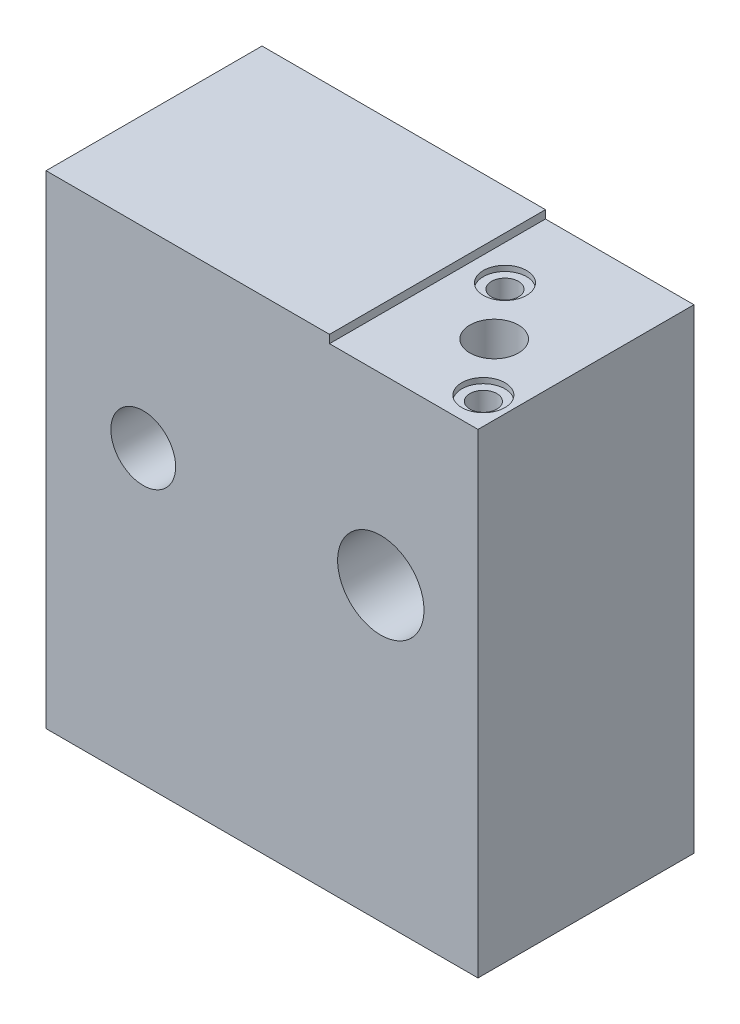
ISO-10303-21;
HEADER;
FILE_DESCRIPTION(('STEP AP214'),'2;1');
FILE_NAME('part.step','',(''),(''),'','','');
FILE_SCHEMA(('AUTOMOTIVE_DESIGN { 1 0 10303 214 1 1 1 1 }'));
ENDSEC;
DATA;
#1=APPLICATION_CONTEXT('core data for automotive mechanical design processes');
#2=APPLICATION_PROTOCOL_DEFINITION('international standard','automotive_design',2000,#1);
#3=PRODUCT_CONTEXT('',#1,'mechanical');
#4=PRODUCT('Part','Part','',(#3));
#5=PRODUCT_RELATED_PRODUCT_CATEGORY('part','',(#4));
#6=PRODUCT_DEFINITION_FORMATION('','',#4);
#7=PRODUCT_DEFINITION_CONTEXT('part definition',#1,'design');
#8=PRODUCT_DEFINITION('design','',#6,#7);
#9=PRODUCT_DEFINITION_SHAPE('','',#8);
#10=(LENGTH_UNIT() NAMED_UNIT(*) SI_UNIT(.MILLI.,.METRE.));
#11=(NAMED_UNIT(*) PLANE_ANGLE_UNIT() SI_UNIT($,.RADIAN.));
#12=(NAMED_UNIT(*) SI_UNIT($,.STERADIAN.) SOLID_ANGLE_UNIT());
#13=UNCERTAINTY_MEASURE_WITH_UNIT(LENGTH_MEASURE(1.E-05),#10,'distance_accuracy_value','');
#14=(GEOMETRIC_REPRESENTATION_CONTEXT(3) GLOBAL_UNCERTAINTY_ASSIGNED_CONTEXT((#13)) GLOBAL_UNIT_ASSIGNED_CONTEXT((#10,
#11,#12)) REPRESENTATION_CONTEXT('',''));
#15=CARTESIAN_POINT('',(0.,0.,0.));
#16=DIRECTION('',(0.,0.,1.));
#17=DIRECTION('',(1.,0.,0.));
#18=AXIS2_PLACEMENT_3D('',#15,#16,#17);
#19=CARTESIAN_POINT('',(40.,89.5,20.));
#20=DIRECTION('',(-1.,0.,0.));
#21=DIRECTION('',(0.,0.,1.));
#22=AXIS2_PLACEMENT_3D('',#19,#20,#21);
#23=PLANE('',#22);
#24=DIRECTION('',(0.,-1.,0.));
#25=VECTOR('',#24,1.);
#26=CARTESIAN_POINT('',(40.,89.5,-20.));
#27=LINE('',#26,#25);
#28=CARTESIAN_POINT('',(40.,88.,-20.));
#29=VERTEX_POINT('',#28);
#30=CARTESIAN_POINT('',(40.,0.,-20.));
#31=VERTEX_POINT('',#30);
#32=EDGE_CURVE('E45',#29,#31,#27,.T.);
#33=ORIENTED_EDGE('',*,*,#32,.F.);
#34=DIRECTION('',(0.,0.,1.));
#35=VECTOR('',#34,1.);
#36=CARTESIAN_POINT('',(40.,88.,-26.));
#37=LINE('',#36,#35);
#38=CARTESIAN_POINT('',(40.,88.,20.));
#39=VERTEX_POINT('',#38);
#40=EDGE_CURVE('E88',#29,#39,#37,.T.);
#41=ORIENTED_EDGE('',*,*,#40,.T.);
#42=DIRECTION('',(0.,-1.,0.));
#43=VECTOR('',#42,1.);
#44=CARTESIAN_POINT('',(40.,89.5,20.));
#45=LINE('',#44,#43);
#46=CARTESIAN_POINT('',(40.,0.,20.));
#47=VERTEX_POINT('',#46);
#48=EDGE_CURVE('E81',#39,#47,#45,.T.);
#49=ORIENTED_EDGE('',*,*,#48,.T.);
#50=DIRECTION('',(0.,0.,-1.));
#51=VECTOR('',#50,1.);
#52=CARTESIAN_POINT('',(40.,0.,20.));
#53=LINE('',#52,#51);
#54=EDGE_CURVE('E85',#47,#31,#53,.T.);
#55=ORIENTED_EDGE('',*,*,#54,.T.);
#56=EDGE_LOOP('',(#33,#41,#49,#55));
#57=FACE_BOUND('',#56,.T.);
#58=ADVANCED_FACE('F37',(#57),#23,.F.);
#59=CARTESIAN_POINT('',(-40.,89.5,-20.));
#60=DIRECTION('',(0.,0.,1.));
#61=DIRECTION('',(1.,0.,0.));
#62=AXIS2_PLACEMENT_3D('',#59,#60,#61);
#63=PLANE('',#62);
#64=CARTESIAN_POINT('',(22.,54.,-20.));
#65=DIRECTION('',(0.,0.,1.));
#66=DIRECTION('',(1.,0.,0.));
#67=AXIS2_PLACEMENT_3D('',#64,#65,#66);
#68=CIRCLE('',#67,8.);
#69=CARTESIAN_POINT('',(30.,54.,-20.));
#70=VERTEX_POINT('',#69);
#71=EDGE_CURVE('E151',#70,#70,#68,.T.);
#72=ORIENTED_EDGE('',*,*,#71,.T.);
#73=EDGE_LOOP('',(#72));
#74=FACE_BOUND('',#73,.T.);
#75=CARTESIAN_POINT('',(-22.,54.,-20.));
#76=DIRECTION('',(0.,0.,1.));
#77=DIRECTION('',(1.,0.,0.));
#78=AXIS2_PLACEMENT_3D('',#75,#76,#77);
#79=CIRCLE('',#78,6.);
#80=CARTESIAN_POINT('',(-16.,54.,-20.));
#81=VERTEX_POINT('',#80);
#82=EDGE_CURVE('E157',#81,#81,#79,.T.);
#83=ORIENTED_EDGE('',*,*,#82,.T.);
#84=EDGE_LOOP('',(#83));
#85=FACE_BOUND('',#84,.T.);
#86=DIRECTION('',(0.,-1.,0.));
#87=VECTOR('',#86,1.);
#88=CARTESIAN_POINT('',(12.5,89.5,-20.));
#89=LINE('',#88,#87);
#90=CARTESIAN_POINT('',(12.5,89.5,-20.));
#91=VERTEX_POINT('',#90);
#92=CARTESIAN_POINT('',(12.5,88.,-20.));
#93=VERTEX_POINT('',#92);
#94=EDGE_CURVE('E53',#91,#93,#89,.T.);
#95=ORIENTED_EDGE('',*,*,#94,.T.);
#96=DIRECTION('',(1.,0.,0.));
#97=VECTOR('',#96,1.);
#98=CARTESIAN_POINT('',(-40.,88.,-20.));
#99=LINE('',#98,#97);
#100=EDGE_CURVE('E107',#93,#29,#99,.T.);
#101=ORIENTED_EDGE('',*,*,#100,.T.);
#102=ORIENTED_EDGE('',*,*,#32,.T.);
#103=DIRECTION('',(-1.,0.,0.));
#104=VECTOR('',#103,1.);
#105=CARTESIAN_POINT('',(-40.,0.,-20.));
#106=LINE('',#105,#104);
#107=CARTESIAN_POINT('',(-40.,0.,-20.));
#108=VERTEX_POINT('',#107);
#109=EDGE_CURVE('E106',#31,#108,#106,.T.);
#110=ORIENTED_EDGE('',*,*,#109,.T.);
#111=DIRECTION('',(0.,-1.,0.));
#112=VECTOR('',#111,1.);
#113=CARTESIAN_POINT('',(-40.,89.5,-20.));
#114=LINE('',#113,#112);
#115=CARTESIAN_POINT('',(-40.,89.5,-20.));
#116=VERTEX_POINT('',#115);
#117=EDGE_CURVE('E117',#116,#108,#114,.T.);
#118=ORIENTED_EDGE('',*,*,#117,.F.);
#119=DIRECTION('',(-1.,0.,0.));
#120=VECTOR('',#119,1.);
#121=CARTESIAN_POINT('',(-40.,89.5,-20.));
#122=LINE('',#121,#120);
#123=EDGE_CURVE('E101',#91,#116,#122,.T.);
#124=ORIENTED_EDGE('',*,*,#123,.F.);
#125=EDGE_LOOP('',(#95,#101,#102,#110,#118,#124));
#126=FACE_BOUND('',#125,.T.);
#127=ADVANCED_FACE('F186',(#74,#85,#126),#63,.F.);
#128=CARTESIAN_POINT('',(-40.,89.5,20.));
#129=DIRECTION('',(1.,0.,0.));
#130=DIRECTION('',(0.,0.,-1.));
#131=AXIS2_PLACEMENT_3D('',#128,#129,#130);
#132=PLANE('',#131);
#133=DIRECTION('',(0.,0.,1.));
#134=VECTOR('',#133,1.);
#135=CARTESIAN_POINT('',(-40.,0.,20.));
#136=LINE('',#135,#134);
#137=CARTESIAN_POINT('',(-40.,0.,20.));
#138=VERTEX_POINT('',#137);
#139=EDGE_CURVE('E102',#108,#138,#136,.T.);
#140=ORIENTED_EDGE('',*,*,#139,.T.);
#141=DIRECTION('',(0.,-1.,0.));
#142=VECTOR('',#141,1.);
#143=CARTESIAN_POINT('',(-40.,89.5,20.));
#144=LINE('',#143,#142);
#145=CARTESIAN_POINT('',(-40.,89.5,20.));
#146=VERTEX_POINT('',#145);
#147=EDGE_CURVE('E91',#146,#138,#144,.T.);
#148=ORIENTED_EDGE('',*,*,#147,.F.);
#149=DIRECTION('',(0.,0.,1.));
#150=VECTOR('',#149,1.);
#151=CARTESIAN_POINT('',(-40.,89.5,20.));
#152=LINE('',#151,#150);
#153=EDGE_CURVE('E61',#116,#146,#152,.T.);
#154=ORIENTED_EDGE('',*,*,#153,.F.);
#155=ORIENTED_EDGE('',*,*,#117,.T.);
#156=EDGE_LOOP('',(#140,#148,#154,#155));
#157=FACE_BOUND('',#156,.T.);
#158=ADVANCED_FACE('F189',(#157),#132,.F.);
#159=CARTESIAN_POINT('',(-40.,89.5,20.));
#160=DIRECTION('',(0.,0.,-1.));
#161=DIRECTION('',(-1.,0.,0.));
#162=AXIS2_PLACEMENT_3D('',#159,#160,#161);
#163=PLANE('',#162);
#164=CARTESIAN_POINT('',(22.,54.,20.));
#165=DIRECTION('',(0.,0.,1.));
#166=DIRECTION('',(1.,0.,0.));
#167=AXIS2_PLACEMENT_3D('',#164,#165,#166);
#168=CIRCLE('',#167,8.);
#169=CARTESIAN_POINT('',(30.,54.,20.));
#170=VERTEX_POINT('',#169);
#171=EDGE_CURVE('E148',#170,#170,#168,.T.);
#172=ORIENTED_EDGE('',*,*,#171,.F.);
#173=EDGE_LOOP('',(#172));
#174=FACE_BOUND('',#173,.T.);
#175=CARTESIAN_POINT('',(-22.,54.,20.));
#176=DIRECTION('',(0.,0.,1.));
#177=DIRECTION('',(1.,0.,0.));
#178=AXIS2_PLACEMENT_3D('',#175,#176,#177);
#179=CIRCLE('',#178,6.);
#180=CARTESIAN_POINT('',(-16.,54.,20.));
#181=VERTEX_POINT('',#180);
#182=EDGE_CURVE('E154',#181,#181,#179,.T.);
#183=ORIENTED_EDGE('',*,*,#182,.F.);
#184=EDGE_LOOP('',(#183));
#185=FACE_BOUND('',#184,.T.);
#186=ORIENTED_EDGE('',*,*,#48,.F.);
#187=DIRECTION('',(1.,0.,0.));
#188=VECTOR('',#187,1.);
#189=CARTESIAN_POINT('',(40.,88.,20.));
#190=LINE('',#189,#188);
#191=CARTESIAN_POINT('',(12.5,88.,20.));
#192=VERTEX_POINT('',#191);
#193=EDGE_CURVE('E163',#192,#39,#190,.T.);
#194=ORIENTED_EDGE('',*,*,#193,.F.);
#195=DIRECTION('',(0.,-1.,0.));
#196=VECTOR('',#195,1.);
#197=CARTESIAN_POINT('',(12.5,89.5,20.));
#198=LINE('',#197,#196);
#199=CARTESIAN_POINT('',(12.5,89.5,20.));
#200=VERTEX_POINT('',#199);
#201=EDGE_CURVE('E160',#200,#192,#198,.T.);
#202=ORIENTED_EDGE('',*,*,#201,.F.);
#203=DIRECTION('',(1.,0.,0.));
#204=VECTOR('',#203,1.);
#205=CARTESIAN_POINT('',(-40.,89.5,20.));
#206=LINE('',#205,#204);
#207=EDGE_CURVE('E92',#146,#200,#206,.T.);
#208=ORIENTED_EDGE('',*,*,#207,.F.);
#209=ORIENTED_EDGE('',*,*,#147,.T.);
#210=DIRECTION('',(1.,0.,0.));
#211=VECTOR('',#210,1.);
#212=CARTESIAN_POINT('',(-40.,0.,20.));
#213=LINE('',#212,#211);
#214=EDGE_CURVE('E96',#138,#47,#213,.T.);
#215=ORIENTED_EDGE('',*,*,#214,.T.);
#216=EDGE_LOOP('',(#186,#194,#202,#208,#209,#215));
#217=FACE_BOUND('',#216,.T.);
#218=ADVANCED_FACE('F97',(#174,#185,#217),#163,.F.);
#219=CARTESIAN_POINT('',(0.,89.5,0.));
#220=DIRECTION('',(0.,-1.,0.));
#221=DIRECTION('',(0.,0.,-1.));
#222=AXIS2_PLACEMENT_3D('',#219,#220,#221);
#223=PLANE('',#222);
#224=ORIENTED_EDGE('',*,*,#207,.T.);
#225=DIRECTION('',(0.,0.,-1.));
#226=VECTOR('',#225,1.);
#227=CARTESIAN_POINT('',(12.5,89.5,0.));
#228=LINE('',#227,#226);
#229=EDGE_CURVE('E11',#200,#91,#228,.T.);
#230=ORIENTED_EDGE('',*,*,#229,.T.);
#231=ORIENTED_EDGE('',*,*,#123,.T.);
#232=ORIENTED_EDGE('',*,*,#153,.T.);
#233=EDGE_LOOP('',(#224,#230,#231,#232));
#234=FACE_BOUND('',#233,.T.);
#235=ADVANCED_FACE('F172',(#234),#223,.F.);
#236=CARTESIAN_POINT('',(0.,0.,0.));
#237=DIRECTION('',(0.,-1.,0.));
#238=DIRECTION('',(0.,0.,-1.));
#239=AXIS2_PLACEMENT_3D('',#236,#237,#238);
#240=PLANE('',#239);
#241=ORIENTED_EDGE('',*,*,#54,.F.);
#242=ORIENTED_EDGE('',*,*,#214,.F.);
#243=ORIENTED_EDGE('',*,*,#139,.F.);
#244=ORIENTED_EDGE('',*,*,#109,.F.);
#245=EDGE_LOOP('',(#241,#242,#243,#244));
#246=FACE_BOUND('',#245,.T.);
#247=ADVANCED_FACE('F105',(#246),#240,.T.);
#248=CARTESIAN_POINT('',(40.,88.,-26.));
#249=DIRECTION('',(0.,-1.,0.));
#250=DIRECTION('',(0.,0.,-1.));
#251=AXIS2_PLACEMENT_3D('',#248,#249,#250);
#252=PLANE('',#251);
#253=CARTESIAN_POINT('',(35.,88.,14.));
#254=DIRECTION('',(0.,1.,0.));
#255=DIRECTION('',(0.,0.,1.));
#256=AXIS2_PLACEMENT_3D('',#253,#254,#255);
#257=CIRCLE('',#256,4.);
#258=CARTESIAN_POINT('',(35.,88.,18.));
#259=VERTEX_POINT('',#258);
#260=EDGE_CURVE('E137',#259,#259,#257,.T.);
#261=ORIENTED_EDGE('',*,*,#260,.F.);
#262=EDGE_LOOP('',(#261));
#263=FACE_BOUND('',#262,.T.);
#264=CARTESIAN_POINT('',(19.,88.,-5.99999999999999));
#265=DIRECTION('',(0.,1.,0.));
#266=DIRECTION('',(0.,0.,1.));
#267=AXIS2_PLACEMENT_3D('',#264,#265,#266);
#268=CIRCLE('',#267,4.);
#269=CARTESIAN_POINT('',(19.,88.,-1.99999999999999));
#270=VERTEX_POINT('',#269);
#271=EDGE_CURVE('E130',#270,#270,#268,.T.);
#272=ORIENTED_EDGE('',*,*,#271,.F.);
#273=EDGE_LOOP('',(#272));
#274=FACE_BOUND('',#273,.T.);
#275=CARTESIAN_POINT('',(27.,88.,4.00000000000001));
#276=DIRECTION('',(0.,1.,0.));
#277=DIRECTION('',(0.,0.,1.));
#278=AXIS2_PLACEMENT_3D('',#275,#276,#277);
#279=CIRCLE('',#278,4.5);
#280=CARTESIAN_POINT('',(27.,88.,8.5));
#281=VERTEX_POINT('',#280);
#282=EDGE_CURVE('E122',#281,#281,#279,.T.);
#283=ORIENTED_EDGE('',*,*,#282,.F.);
#284=EDGE_LOOP('',(#283));
#285=FACE_BOUND('',#284,.T.);
#286=DIRECTION('',(0.,0.,1.));
#287=VECTOR('',#286,1.);
#288=CARTESIAN_POINT('',(12.5,88.,-26.));
#289=LINE('',#288,#287);
#290=EDGE_CURVE('E166',#93,#192,#289,.T.);
#291=ORIENTED_EDGE('',*,*,#290,.T.);
#292=ORIENTED_EDGE('',*,*,#193,.T.);
#293=ORIENTED_EDGE('',*,*,#40,.F.);
#294=ORIENTED_EDGE('',*,*,#100,.F.);
#295=EDGE_LOOP('',(#291,#292,#293,#294));
#296=FACE_BOUND('',#295,.T.);
#297=ADVANCED_FACE('F184',(#263,#274,#285,#296),#252,.F.);
#298=CARTESIAN_POINT('',(12.5,89.5,-26.));
#299=DIRECTION('',(-1.,0.,0.));
#300=DIRECTION('',(0.,0.,1.));
#301=AXIS2_PLACEMENT_3D('',#298,#299,#300);
#302=PLANE('',#301);
#303=ORIENTED_EDGE('',*,*,#229,.F.);
#304=ORIENTED_EDGE('',*,*,#201,.T.);
#305=ORIENTED_EDGE('',*,*,#290,.F.);
#306=ORIENTED_EDGE('',*,*,#94,.F.);
#307=EDGE_LOOP('',(#303,#304,#305,#306));
#308=FACE_BOUND('',#307,.T.);
#309=ADVANCED_FACE('F177',(#308),#302,.F.);
#310=CARTESIAN_POINT('',(-22.,54.,-26.));
#311=DIRECTION('',(0.,0.,1.));
#312=DIRECTION('',(1.,0.,0.));
#313=AXIS2_PLACEMENT_3D('',#310,#311,#312);
#314=CYLINDRICAL_SURFACE('',#313,6.);
#315=ORIENTED_EDGE('',*,*,#182,.T.);
#316=EDGE_LOOP('',(#315));
#317=FACE_BOUND('',#316,.T.);
#318=ORIENTED_EDGE('',*,*,#82,.F.);
#319=EDGE_LOOP('',(#318));
#320=FACE_BOUND('',#319,.T.);
#321=ADVANCED_FACE('F226',(#317,#320),#314,.F.);
#322=CARTESIAN_POINT('',(22.,54.,-26.));
#323=DIRECTION('',(0.,0.,1.));
#324=DIRECTION('',(1.,0.,0.));
#325=AXIS2_PLACEMENT_3D('',#322,#323,#324);
#326=CYLINDRICAL_SURFACE('',#325,8.);
#327=ORIENTED_EDGE('',*,*,#171,.T.);
#328=EDGE_LOOP('',(#327));
#329=FACE_BOUND('',#328,.T.);
#330=ORIENTED_EDGE('',*,*,#71,.F.);
#331=EDGE_LOOP('',(#330));
#332=FACE_BOUND('',#331,.T.);
#333=ADVANCED_FACE('F231',(#329,#332),#326,.F.);
#334=CARTESIAN_POINT('',(27.,73.,4.00000000000001));
#335=DIRECTION('',(0.,1.,0.));
#336=DIRECTION('',(0.,0.,1.));
#337=AXIS2_PLACEMENT_3D('',#334,#335,#336);
#338=CYLINDRICAL_SURFACE('',#337,4.5);
#339=CARTESIAN_POINT('',(27.,73.,4.00000000000001));
#340=DIRECTION('',(0.,1.,0.));
#341=DIRECTION('',(0.,0.,1.));
#342=AXIS2_PLACEMENT_3D('',#339,#340,#341);
#343=CIRCLE('',#342,4.5);
#344=CARTESIAN_POINT('',(27.,73.,8.5));
#345=VERTEX_POINT('',#344);
#346=EDGE_CURVE('E127',#345,#345,#343,.T.);
#347=ORIENTED_EDGE('',*,*,#346,.F.);
#348=EDGE_LOOP('',(#347));
#349=FACE_BOUND('',#348,.T.);
#350=ORIENTED_EDGE('',*,*,#282,.T.);
#351=EDGE_LOOP('',(#350));
#352=FACE_BOUND('',#351,.T.);
#353=ADVANCED_FACE('F241',(#349,#352),#338,.F.);
#354=CARTESIAN_POINT('',(27.,73.,4.00000000000001));
#355=DIRECTION('',(0.,1.,0.));
#356=DIRECTION('',(0.,0.,1.));
#357=AXIS2_PLACEMENT_3D('',#354,#355,#356);
#358=PLANE('',#357);
#359=ORIENTED_EDGE('',*,*,#346,.T.);
#360=EDGE_LOOP('',(#359));
#361=FACE_BOUND('',#360,.T.);
#362=ADVANCED_FACE('F279',(#361),#358,.T.);
#363=CARTESIAN_POINT('',(19.,87.,-5.99999999999999));
#364=DIRECTION('',(0.,1.,0.));
#365=DIRECTION('',(0.,0.,1.));
#366=AXIS2_PLACEMENT_3D('',#363,#364,#365);
#367=PLANE('',#366);
#368=CARTESIAN_POINT('',(19.,87.,-5.99999999999999));
#369=DIRECTION('',(0.,1.,0.));
#370=DIRECTION('',(0.,0.,1.));
#371=AXIS2_PLACEMENT_3D('',#368,#369,#370);
#372=CIRCLE('',#371,4.);
#373=CARTESIAN_POINT('',(19.,87.,-1.99999999999999));
#374=VERTEX_POINT('',#373);
#375=EDGE_CURVE('E123',#374,#374,#372,.T.);
#376=ORIENTED_EDGE('',*,*,#375,.T.);
#377=EDGE_LOOP('',(#376));
#378=FACE_BOUND('',#377,.T.);
#379=CARTESIAN_POINT('',(19.,87.,-5.99999999999999));
#380=DIRECTION('',(0.,1.,0.));
#381=DIRECTION('',(0.,0.,1.));
#382=AXIS2_PLACEMENT_3D('',#379,#380,#381);
#383=CIRCLE('',#382,2.5);
#384=CARTESIAN_POINT('',(19.,87.,-3.49999999999999));
#385=VERTEX_POINT('',#384);
#386=EDGE_CURVE('E120',#385,#385,#383,.F.);
#387=ORIENTED_EDGE('',*,*,#386,.T.);
#388=EDGE_LOOP('',(#387));
#389=FACE_BOUND('',#388,.T.);
#390=ADVANCED_FACE('F289',(#378,#389),#367,.T.);
#391=CARTESIAN_POINT('',(19.,87.,-5.99999999999999));
#392=DIRECTION('',(0.,1.,0.));
#393=DIRECTION('',(0.,0.,1.));
#394=AXIS2_PLACEMENT_3D('',#391,#392,#393);
#395=CYLINDRICAL_SURFACE('',#394,4.);
#396=ORIENTED_EDGE('',*,*,#375,.F.);
#397=EDGE_LOOP('',(#396));
#398=FACE_BOUND('',#397,.T.);
#399=ORIENTED_EDGE('',*,*,#271,.T.);
#400=EDGE_LOOP('',(#399));
#401=FACE_BOUND('',#400,.T.);
#402=ADVANCED_FACE('F268',(#398,#401),#395,.F.);
#403=CARTESIAN_POINT('',(19.,73.,-5.99999999999999));
#404=DIRECTION('',(0.,1.,0.));
#405=DIRECTION('',(0.,0.,1.));
#406=AXIS2_PLACEMENT_3D('',#403,#404,#405);
#407=PLANE('',#406);
#408=CARTESIAN_POINT('',(19.,73.,-5.99999999999999));
#409=DIRECTION('',(0.,1.,0.));
#410=DIRECTION('',(0.,0.,1.));
#411=AXIS2_PLACEMENT_3D('',#408,#409,#410);
#412=CIRCLE('',#411,2.5);
#413=CARTESIAN_POINT('',(19.,73.,-3.49999999999999));
#414=VERTEX_POINT('',#413);
#415=EDGE_CURVE('E141',#414,#414,#412,.T.);
#416=ORIENTED_EDGE('',*,*,#415,.T.);
#417=EDGE_LOOP('',(#416));
#418=FACE_BOUND('',#417,.T.);
#419=ADVANCED_FACE('F263',(#418),#407,.T.);
#420=CARTESIAN_POINT('',(19.,73.,-5.99999999999999));
#421=DIRECTION('',(0.,1.,0.));
#422=DIRECTION('',(0.,0.,1.));
#423=AXIS2_PLACEMENT_3D('',#420,#421,#422);
#424=CYLINDRICAL_SURFACE('',#423,2.5);
#425=ORIENTED_EDGE('',*,*,#415,.F.);
#426=EDGE_LOOP('',(#425));
#427=FACE_BOUND('',#426,.T.);
#428=ORIENTED_EDGE('',*,*,#386,.F.);
#429=EDGE_LOOP('',(#428));
#430=FACE_BOUND('',#429,.T.);
#431=ADVANCED_FACE('F267',(#427,#430),#424,.F.);
#432=CARTESIAN_POINT('',(35.,87.,14.));
#433=DIRECTION('',(0.,1.,0.));
#434=DIRECTION('',(0.,0.,1.));
#435=AXIS2_PLACEMENT_3D('',#432,#433,#434);
#436=PLANE('',#435);
#437=CARTESIAN_POINT('',(35.,87.,14.));
#438=DIRECTION('',(0.,1.,0.));
#439=DIRECTION('',(0.,0.,1.));
#440=AXIS2_PLACEMENT_3D('',#437,#438,#439);
#441=CIRCLE('',#440,4.);
#442=CARTESIAN_POINT('',(35.,87.,18.));
#443=VERTEX_POINT('',#442);
#444=EDGE_CURVE('E375',#443,#443,#441,.T.);
#445=ORIENTED_EDGE('',*,*,#444,.T.);
#446=EDGE_LOOP('',(#445));
#447=FACE_BOUND('',#446,.T.);
#448=CARTESIAN_POINT('',(35.,87.,14.));
#449=DIRECTION('',(0.,1.,0.));
#450=DIRECTION('',(0.,0.,1.));
#451=AXIS2_PLACEMENT_3D('',#448,#449,#450);
#452=CIRCLE('',#451,2.5);
#453=CARTESIAN_POINT('',(35.,87.,16.5));
#454=VERTEX_POINT('',#453);
#455=EDGE_CURVE('E40',#454,#454,#452,.F.);
#456=ORIENTED_EDGE('',*,*,#455,.T.);
#457=EDGE_LOOP('',(#456));
#458=FACE_BOUND('',#457,.T.);
#459=ADVANCED_FACE('F327',(#447,#458),#436,.T.);
#460=CARTESIAN_POINT('',(35.,87.,14.));
#461=DIRECTION('',(0.,1.,0.));
#462=DIRECTION('',(0.,0.,1.));
#463=AXIS2_PLACEMENT_3D('',#460,#461,#462);
#464=CYLINDRICAL_SURFACE('',#463,4.);
#465=ORIENTED_EDGE('',*,*,#444,.F.);
#466=EDGE_LOOP('',(#465));
#467=FACE_BOUND('',#466,.T.);
#468=ORIENTED_EDGE('',*,*,#260,.T.);
#469=EDGE_LOOP('',(#468));
#470=FACE_BOUND('',#469,.T.);
#471=ADVANCED_FACE('F254',(#467,#470),#464,.F.);
#472=CARTESIAN_POINT('',(35.,73.,14.));
#473=DIRECTION('',(0.,1.,0.));
#474=DIRECTION('',(0.,0.,1.));
#475=AXIS2_PLACEMENT_3D('',#472,#473,#474);
#476=PLANE('',#475);
#477=CARTESIAN_POINT('',(35.,73.,14.));
#478=DIRECTION('',(0.,1.,0.));
#479=DIRECTION('',(0.,0.,1.));
#480=AXIS2_PLACEMENT_3D('',#477,#478,#479);
#481=CIRCLE('',#480,2.5);
#482=CARTESIAN_POINT('',(35.,73.,16.5));
#483=VERTEX_POINT('',#482);
#484=EDGE_CURVE('E145',#483,#483,#481,.T.);
#485=ORIENTED_EDGE('',*,*,#484,.T.);
#486=EDGE_LOOP('',(#485));
#487=FACE_BOUND('',#486,.T.);
#488=ADVANCED_FACE('F249',(#487),#476,.T.);
#489=CARTESIAN_POINT('',(35.,73.,14.));
#490=DIRECTION('',(0.,1.,0.));
#491=DIRECTION('',(0.,0.,1.));
#492=AXIS2_PLACEMENT_3D('',#489,#490,#491);
#493=CYLINDRICAL_SURFACE('',#492,2.5);
#494=ORIENTED_EDGE('',*,*,#484,.F.);
#495=EDGE_LOOP('',(#494));
#496=FACE_BOUND('',#495,.T.);
#497=ORIENTED_EDGE('',*,*,#455,.F.);
#498=EDGE_LOOP('',(#497));
#499=FACE_BOUND('',#498,.T.);
#500=ADVANCED_FACE('F253',(#496,#499),#493,.F.);
#501=CLOSED_SHELL('',(#58,#127,#158,#218,#235,#247,#297,#309,#321,#333,#353,#362,#390,#402,#419,
#431,#459,#471,#488,#500));
#502=MANIFOLD_SOLID_BREP('B2',#501);
#503=ADVANCED_BREP_SHAPE_REPRESENTATION('',(#18,#502),#14);
#504=SHAPE_DEFINITION_REPRESENTATION(#9,#503);
ENDSEC;
END-ISO-10303-21;
